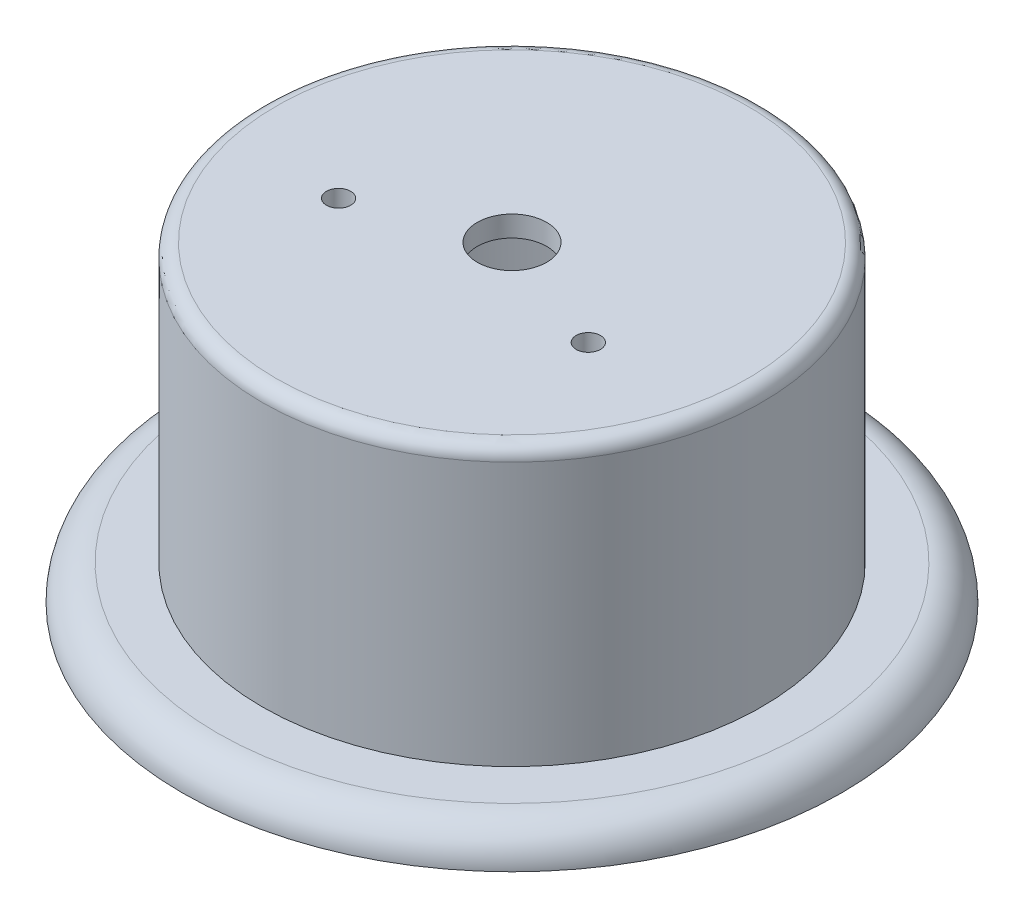
ISO-10303-21;
HEADER;
FILE_DESCRIPTION(('STEP AP214'),'2;1');
FILE_NAME('part.step','',(''),(''),'','','');
FILE_SCHEMA(('AUTOMOTIVE_DESIGN { 1 0 10303 214 1 1 1 1 }'));
ENDSEC;
DATA;
#1=APPLICATION_CONTEXT('core data for automotive mechanical design processes');
#2=APPLICATION_PROTOCOL_DEFINITION('international standard','automotive_design',2000,#1);
#3=PRODUCT_CONTEXT('',#1,'mechanical');
#4=PRODUCT('Part','Part','',(#3));
#5=PRODUCT_RELATED_PRODUCT_CATEGORY('part','',(#4));
#6=PRODUCT_DEFINITION_FORMATION('','',#4);
#7=PRODUCT_DEFINITION_CONTEXT('part definition',#1,'design');
#8=PRODUCT_DEFINITION('design','',#6,#7);
#9=PRODUCT_DEFINITION_SHAPE('','',#8);
#10=(LENGTH_UNIT() NAMED_UNIT(*) SI_UNIT(.MILLI.,.METRE.));
#11=(NAMED_UNIT(*) PLANE_ANGLE_UNIT() SI_UNIT($,.RADIAN.));
#12=(NAMED_UNIT(*) SI_UNIT($,.STERADIAN.) SOLID_ANGLE_UNIT());
#13=UNCERTAINTY_MEASURE_WITH_UNIT(LENGTH_MEASURE(1.E-05),#10,'distance_accuracy_value','');
#14=(GEOMETRIC_REPRESENTATION_CONTEXT(3) GLOBAL_UNCERTAINTY_ASSIGNED_CONTEXT((#13)) GLOBAL_UNIT_ASSIGNED_CONTEXT((#10,
#11,#12)) REPRESENTATION_CONTEXT('',''));
#15=CARTESIAN_POINT('',(0.,0.,0.));
#16=DIRECTION('',(0.,0.,1.));
#17=DIRECTION('',(1.,0.,0.));
#18=AXIS2_PLACEMENT_3D('',#15,#16,#17);
#19=CARTESIAN_POINT('',(0.,5.,0.));
#20=DIRECTION('',(0.,1.,0.));
#21=DIRECTION('',(0.,0.,1.));
#22=AXIS2_PLACEMENT_3D('',#19,#20,#21);
#23=PLANE('',#22);
#24=CARTESIAN_POINT('',(0.,5.,0.));
#25=DIRECTION('',(0.,1.,0.));
#26=DIRECTION('',(0.,0.,1.));
#27=AXIS2_PLACEMENT_3D('',#24,#25,#26);
#28=CIRCLE('',#27,42.5);
#29=CARTESIAN_POINT('',(0.,5.,42.5));
#30=VERTEX_POINT('',#29);
#31=EDGE_CURVE('E41',#30,#30,#28,.T.);
#32=ORIENTED_EDGE('',*,*,#31,.T.);
#33=EDGE_LOOP('',(#32));
#34=FACE_BOUND('',#33,.T.);
#35=CARTESIAN_POINT('',(0.,5.,0.));
#36=DIRECTION('',(0.,1.,0.));
#37=DIRECTION('',(0.,0.,1.));
#38=AXIS2_PLACEMENT_3D('',#35,#36,#37);
#39=CIRCLE('',#38,36.);
#40=CARTESIAN_POINT('',(0.,5.,36.));
#41=VERTEX_POINT('',#40);
#42=EDGE_CURVE('E63',#41,#41,#39,.T.);
#43=ORIENTED_EDGE('',*,*,#42,.F.);
#44=EDGE_LOOP('',(#43));
#45=FACE_BOUND('',#44,.T.);
#46=ADVANCED_FACE('F30',(#34,#45),#23,.T.);
#47=CARTESIAN_POINT('',(0.,0.,0.));
#48=DIRECTION('',(0.,1.,0.));
#49=DIRECTION('',(0.,0.,1.));
#50=AXIS2_PLACEMENT_3D('',#47,#48,#49);
#51=PLANE('',#50);
#52=CARTESIAN_POINT('',(0.,0.,0.));
#53=DIRECTION('',(0.,-1.,0.));
#54=DIRECTION('',(0.,0.,-1.));
#55=AXIS2_PLACEMENT_3D('',#52,#53,#54);
#56=CIRCLE('',#55,34.5);
#57=CARTESIAN_POINT('',(0.,0.,-34.5));
#58=VERTEX_POINT('',#57);
#59=EDGE_CURVE('E60',#58,#58,#56,.T.);
#60=ORIENTED_EDGE('',*,*,#59,.F.);
#61=EDGE_LOOP('',(#60));
#62=FACE_BOUND('',#61,.T.);
#63=CARTESIAN_POINT('',(0.,0.,0.));
#64=DIRECTION('',(0.,1.,0.));
#65=DIRECTION('',(0.,0.,1.));
#66=AXIS2_PLACEMENT_3D('',#63,#64,#65);
#67=CIRCLE('',#66,47.5);
#68=CARTESIAN_POINT('',(0.,0.,47.5));
#69=VERTEX_POINT('',#68);
#70=EDGE_CURVE('E45',#69,#69,#67,.T.);
#71=ORIENTED_EDGE('',*,*,#70,.F.);
#72=EDGE_LOOP('',(#71));
#73=FACE_BOUND('',#72,.T.);
#74=ADVANCED_FACE('F106',(#62,#73),#51,.F.);
#75=CARTESIAN_POINT('',(0.,45.,0.));
#76=DIRECTION('',(0.,-1.,0.));
#77=DIRECTION('',(0.,0.,-1.));
#78=AXIS2_PLACEMENT_3D('',#75,#76,#77);
#79=CYLINDRICAL_SURFACE('',#78,36.);
#80=CARTESIAN_POINT('',(0.,43.,0.));
#81=DIRECTION('',(0.,1.,0.));
#82=DIRECTION('',(0.,0.,1.));
#83=AXIS2_PLACEMENT_3D('',#80,#81,#82);
#84=CIRCLE('',#83,36.);
#85=CARTESIAN_POINT('',(0.,43.,36.));
#86=VERTEX_POINT('',#85);
#87=EDGE_CURVE('E10',#86,#86,#84,.F.);
#88=ORIENTED_EDGE('',*,*,#87,.T.);
#89=EDGE_LOOP('',(#88));
#90=FACE_BOUND('',#89,.T.);
#91=ORIENTED_EDGE('',*,*,#42,.T.);
#92=EDGE_LOOP('',(#91));
#93=FACE_BOUND('',#92,.T.);
#94=ADVANCED_FACE('F84',(#90,#93),#79,.T.);
#95=CARTESIAN_POINT('',(0.,45.,0.));
#96=DIRECTION('',(0.,1.,0.));
#97=DIRECTION('',(0.,0.,1.));
#98=AXIS2_PLACEMENT_3D('',#95,#96,#97);
#99=PLANE('',#98);
#100=CARTESIAN_POINT('',(0.,45.,0.));
#101=DIRECTION('',(0.,1.,0.));
#102=DIRECTION('',(0.,0.,1.));
#103=AXIS2_PLACEMENT_3D('',#100,#101,#102);
#104=CIRCLE('',#103,34.);
#105=CARTESIAN_POINT('',(0.,45.,34.));
#106=VERTEX_POINT('',#105);
#107=EDGE_CURVE('E37',#106,#106,#104,.T.);
#108=ORIENTED_EDGE('',*,*,#107,.T.);
#109=EDGE_LOOP('',(#108));
#110=FACE_BOUND('',#109,.T.);
#111=CARTESIAN_POINT('',(-18.,45.,7.));
#112=DIRECTION('',(0.,1.,0.));
#113=DIRECTION('',(0.,0.,1.));
#114=AXIS2_PLACEMENT_3D('',#111,#112,#113);
#115=CIRCLE('',#114,1.75);
#116=CARTESIAN_POINT('',(-18.,45.,8.75));
#117=VERTEX_POINT('',#116);
#118=EDGE_CURVE('E52',#117,#117,#115,.T.);
#119=ORIENTED_EDGE('',*,*,#118,.F.);
#120=EDGE_LOOP('',(#119));
#121=FACE_BOUND('',#120,.T.);
#122=CARTESIAN_POINT('',(18.,45.,7.));
#123=DIRECTION('',(0.,1.,0.));
#124=DIRECTION('',(0.,0.,1.));
#125=AXIS2_PLACEMENT_3D('',#122,#123,#124);
#126=CIRCLE('',#125,1.75);
#127=CARTESIAN_POINT('',(18.,45.,8.75));
#128=VERTEX_POINT('',#127);
#129=EDGE_CURVE('E51',#128,#128,#126,.T.);
#130=ORIENTED_EDGE('',*,*,#129,.F.);
#131=EDGE_LOOP('',(#130));
#132=FACE_BOUND('',#131,.T.);
#133=CARTESIAN_POINT('',(0.,45.,0.));
#134=DIRECTION('',(0.,1.,0.));
#135=DIRECTION('',(0.,0.,1.));
#136=AXIS2_PLACEMENT_3D('',#133,#134,#135);
#137=CIRCLE('',#136,5.);
#138=CARTESIAN_POINT('',(0.,45.,5.));
#139=VERTEX_POINT('',#138);
#140=EDGE_CURVE('E55',#139,#139,#137,.T.);
#141=ORIENTED_EDGE('',*,*,#140,.F.);
#142=EDGE_LOOP('',(#141));
#143=FACE_BOUND('',#142,.T.);
#144=ADVANCED_FACE('F80',(#110,#121,#132,#143),#99,.T.);
#145=CARTESIAN_POINT('',(0.,42.,0.));
#146=DIRECTION('',(0.,-1.,0.));
#147=DIRECTION('',(0.,0.,-1.));
#148=AXIS2_PLACEMENT_3D('',#145,#146,#147);
#149=CYLINDRICAL_SURFACE('',#148,34.5);
#150=CARTESIAN_POINT('',(0.,42.,0.));
#151=DIRECTION('',(0.,-1.,0.));
#152=DIRECTION('',(0.,0.,-1.));
#153=AXIS2_PLACEMENT_3D('',#150,#151,#152);
#154=CIRCLE('',#153,34.5);
#155=CARTESIAN_POINT('',(0.,42.,-34.5));
#156=VERTEX_POINT('',#155);
#157=EDGE_CURVE('E66',#156,#156,#154,.T.);
#158=CARTESIAN_POINT('',(0.,42.,-34.5));
#159=CARTESIAN_POINT('',(0.,41.5625,-34.5));
#160=CARTESIAN_POINT('',(0.,41.125,-34.5));
#161=CARTESIAN_POINT('',(0.,40.25,-34.5));
#162=CARTESIAN_POINT('',(0.,39.8125,-34.5));
#163=CARTESIAN_POINT('',(0.,38.9375,-34.5));
#164=CARTESIAN_POINT('',(0.,38.5,-34.5));
#165=CARTESIAN_POINT('',(0.,37.625,-34.5));
#166=CARTESIAN_POINT('',(0.,37.1875,-34.5));
#167=CARTESIAN_POINT('',(0.,36.3125,-34.5));
#168=CARTESIAN_POINT('',(0.,35.875,-34.5));
#169=CARTESIAN_POINT('',(0.,35.,-34.5));
#170=CARTESIAN_POINT('',(0.,34.5625,-34.5));
#171=CARTESIAN_POINT('',(0.,33.6875,-34.5));
#172=CARTESIAN_POINT('',(0.,33.25,-34.5));
#173=CARTESIAN_POINT('',(0.,32.375,-34.5));
#174=CARTESIAN_POINT('',(0.,31.9375,-34.5));
#175=CARTESIAN_POINT('',(0.,31.0625,-34.5));
#176=CARTESIAN_POINT('',(0.,30.625,-34.5));
#177=CARTESIAN_POINT('',(0.,29.75,-34.5));
#178=CARTESIAN_POINT('',(0.,29.3125,-34.5));
#179=CARTESIAN_POINT('',(0.,28.4375,-34.5));
#180=CARTESIAN_POINT('',(0.,28.,-34.5));
#181=CARTESIAN_POINT('',(0.,27.125,-34.5));
#182=CARTESIAN_POINT('',(0.,26.6875,-34.5));
#183=CARTESIAN_POINT('',(0.,25.8125,-34.5));
#184=CARTESIAN_POINT('',(0.,25.375,-34.5));
#185=CARTESIAN_POINT('',(0.,24.5,-34.5));
#186=CARTESIAN_POINT('',(0.,24.0625,-34.5));
#187=CARTESIAN_POINT('',(0.,23.1875,-34.5));
#188=CARTESIAN_POINT('',(0.,22.75,-34.5));
#189=CARTESIAN_POINT('',(0.,21.875,-34.5));
#190=CARTESIAN_POINT('',(0.,21.4375,-34.5));
#191=CARTESIAN_POINT('',(0.,20.5625,-34.5));
#192=CARTESIAN_POINT('',(0.,20.125,-34.5));
#193=CARTESIAN_POINT('',(0.,19.25,-34.5));
#194=CARTESIAN_POINT('',(0.,18.8125,-34.5));
#195=CARTESIAN_POINT('',(0.,17.9375,-34.5));
#196=CARTESIAN_POINT('',(0.,17.5,-34.5));
#197=CARTESIAN_POINT('',(0.,16.625,-34.5));
#198=CARTESIAN_POINT('',(0.,16.1875,-34.5));
#199=CARTESIAN_POINT('',(0.,15.3125,-34.5));
#200=CARTESIAN_POINT('',(0.,14.875,-34.5));
#201=CARTESIAN_POINT('',(0.,14.,-34.5));
#202=CARTESIAN_POINT('',(0.,13.5625,-34.5));
#203=CARTESIAN_POINT('',(0.,12.6875,-34.5));
#204=CARTESIAN_POINT('',(0.,12.25,-34.5));
#205=CARTESIAN_POINT('',(0.,11.375,-34.5));
#206=CARTESIAN_POINT('',(0.,10.9375,-34.5));
#207=CARTESIAN_POINT('',(0.,10.0625,-34.5));
#208=CARTESIAN_POINT('',(0.,9.625,-34.5));
#209=CARTESIAN_POINT('',(0.,8.75,-34.5));
#210=CARTESIAN_POINT('',(0.,8.3125,-34.5));
#211=CARTESIAN_POINT('',(0.,7.4375,-34.5));
#212=CARTESIAN_POINT('',(0.,7.,-34.5));
#213=CARTESIAN_POINT('',(0.,6.12500000000001,-34.5));
#214=CARTESIAN_POINT('',(0.,5.68750000000001,-34.5));
#215=CARTESIAN_POINT('',(0.,4.8125,-34.5));
#216=CARTESIAN_POINT('',(0.,4.375,-34.5));
#217=CARTESIAN_POINT('',(0.,3.5,-34.5));
#218=CARTESIAN_POINT('',(0.,3.0625,-34.5));
#219=CARTESIAN_POINT('',(0.,2.1875,-34.5));
#220=CARTESIAN_POINT('',(0.,1.75,-34.5));
#221=CARTESIAN_POINT('',(0.,0.875000000000001,-34.5));
#222=CARTESIAN_POINT('',(0.,0.4375,-34.5));
#223=CARTESIAN_POINT('',(0.,0.,-34.5));
#224=B_SPLINE_CURVE_WITH_KNOTS('',3,(#158,#159,#160,#161,#162,#163,#164,#165,#166,#167,#168,
#169,#170,#171,#172,#173,#174,#175,#176,#177,#178,#179,#180,#181,#182,#183,#184,#185,#186,#187,
#188,#189,#190,#191,#192,#193,#194,#195,#196,#197,#198,#199,#200,#201,#202,#203,#204,#205,#206,
#207,#208,#209,#210,#211,#212,#213,#214,#215,#216,#217,#218,#219,#220,#221,#222,#223),
.UNSPECIFIED.,.F.,.F.,(4,2,2,2,2,2,2,2,2,2,2,2,2,2,2,2,2,2,2,2,2,2,2,2,2,2,2,2,2,2,2,2,4),(0.,
1.3125,2.625,3.9375,5.25,6.56250000000001,7.87500000000001,9.1875,10.5,11.8125,13.125,14.4375,
15.75,17.0625,18.375,19.6875,21.,22.3125,23.625,24.9375,26.25,27.5625,28.875,30.1875,31.5,
32.8125,34.125,35.4375,36.75,38.0625,39.375,40.6875,42.),.UNSPECIFIED.);
#225=EDGE_CURVE('BSEAM83',#156,#58,#224,.T.);
#226=ORIENTED_EDGE('',*,*,#157,.F.);
#227=ORIENTED_EDGE('',*,*,#59,.T.);
#228=ORIENTED_EDGE('',*,*,#225,.T.);
#229=ORIENTED_EDGE('',*,*,#225,.F.);
#230=EDGE_LOOP('',(#226,#228,#227,#229));
#231=FACE_BOUND('',#230,.T.);
#232=ADVANCED_FACE('F83',(#231),#149,.F.);
#233=CARTESIAN_POINT('',(0.,42.,0.));
#234=DIRECTION('',(0.,-1.,0.));
#235=DIRECTION('',(0.,0.,-1.));
#236=AXIS2_PLACEMENT_3D('',#233,#234,#235);
#237=PLANE('',#236);
#238=CARTESIAN_POINT('',(-18.,42.,7.));
#239=DIRECTION('',(0.,-1.,0.));
#240=DIRECTION('',(0.,0.,-1.));
#241=AXIS2_PLACEMENT_3D('',#238,#239,#240);
#242=CIRCLE('',#241,1.75);
#243=CARTESIAN_POINT('',(-18.,42.,5.25));
#244=VERTEX_POINT('',#243);
#245=EDGE_CURVE('E48',#244,#244,#242,.T.);
#246=ORIENTED_EDGE('',*,*,#245,.F.);
#247=EDGE_LOOP('',(#246));
#248=FACE_BOUND('',#247,.T.);
#249=CARTESIAN_POINT('',(18.,42.,7.));
#250=DIRECTION('',(0.,-1.,0.));
#251=DIRECTION('',(0.,0.,-1.));
#252=AXIS2_PLACEMENT_3D('',#249,#250,#251);
#253=CIRCLE('',#252,1.75);
#254=CARTESIAN_POINT('',(18.,42.,5.25));
#255=VERTEX_POINT('',#254);
#256=EDGE_CURVE('E53',#255,#255,#253,.T.);
#257=ORIENTED_EDGE('',*,*,#256,.F.);
#258=EDGE_LOOP('',(#257));
#259=FACE_BOUND('',#258,.T.);
#260=CARTESIAN_POINT('',(0.,42.,0.));
#261=DIRECTION('',(0.,-1.,0.));
#262=DIRECTION('',(0.,0.,-1.));
#263=AXIS2_PLACEMENT_3D('',#260,#261,#262);
#264=CIRCLE('',#263,5.);
#265=CARTESIAN_POINT('',(0.,42.,-5.));
#266=VERTEX_POINT('',#265);
#267=EDGE_CURVE('E57',#266,#266,#264,.T.);
#268=ORIENTED_EDGE('',*,*,#267,.F.);
#269=EDGE_LOOP('',(#268));
#270=FACE_BOUND('',#269,.T.);
#271=ORIENTED_EDGE('',*,*,#157,.T.);
#272=EDGE_LOOP('',(#271));
#273=FACE_BOUND('',#272,.T.);
#274=ADVANCED_FACE('F93',(#248,#259,#270,#273),#237,.T.);
#275=CARTESIAN_POINT('',(0.,40.,0.));
#276=DIRECTION('',(0.,1.,0.));
#277=DIRECTION('',(0.,0.,1.));
#278=AXIS2_PLACEMENT_3D('',#275,#276,#277);
#279=CYLINDRICAL_SURFACE('',#278,5.);
#280=ORIENTED_EDGE('',*,*,#267,.T.);
#281=EDGE_LOOP('',(#280));
#282=FACE_BOUND('',#281,.T.);
#283=ORIENTED_EDGE('',*,*,#140,.T.);
#284=EDGE_LOOP('',(#283));
#285=FACE_BOUND('',#284,.T.);
#286=ADVANCED_FACE('F90',(#282,#285),#279,.F.);
#287=CARTESIAN_POINT('',(0.,0.,0.));
#288=DIRECTION('',(0.,1.,0.));
#289=DIRECTION('',(0.,0.,1.));
#290=AXIS2_PLACEMENT_3D('',#287,#288,#289);
#291=TOROIDAL_SURFACE('',#290,42.5,5.);
#292=ORIENTED_EDGE('',*,*,#70,.T.);
#293=EDGE_LOOP('',(#292));
#294=FACE_BOUND('',#293,.T.);
#295=ORIENTED_EDGE('',*,*,#31,.F.);
#296=EDGE_LOOP('',(#295));
#297=FACE_BOUND('',#296,.T.);
#298=ADVANCED_FACE('F92',(#294,#297),#291,.T.);
#299=CARTESIAN_POINT('',(18.,40.,7.));
#300=DIRECTION('',(0.,1.,0.));
#301=DIRECTION('',(0.,0.,1.));
#302=AXIS2_PLACEMENT_3D('',#299,#300,#301);
#303=CYLINDRICAL_SURFACE('',#302,1.75);
#304=ORIENTED_EDGE('',*,*,#256,.T.);
#305=EDGE_LOOP('',(#304));
#306=FACE_BOUND('',#305,.T.);
#307=ORIENTED_EDGE('',*,*,#129,.T.);
#308=EDGE_LOOP('',(#307));
#309=FACE_BOUND('',#308,.T.);
#310=ADVANCED_FACE('F100',(#306,#309),#303,.F.);
#311=CARTESIAN_POINT('',(-18.,40.,7.));
#312=DIRECTION('',(0.,1.,0.));
#313=DIRECTION('',(0.,0.,1.));
#314=AXIS2_PLACEMENT_3D('',#311,#312,#313);
#315=CYLINDRICAL_SURFACE('',#314,1.75);
#316=ORIENTED_EDGE('',*,*,#245,.T.);
#317=EDGE_LOOP('',(#316));
#318=FACE_BOUND('',#317,.T.);
#319=ORIENTED_EDGE('',*,*,#118,.T.);
#320=EDGE_LOOP('',(#319));
#321=FACE_BOUND('',#320,.T.);
#322=ADVANCED_FACE('F78',(#318,#321),#315,.F.);
#323=CARTESIAN_POINT('',(0.,43.,0.));
#324=DIRECTION('',(0.,1.,0.));
#325=DIRECTION('',(0.,0.,1.));
#326=AXIS2_PLACEMENT_3D('',#323,#324,#325);
#327=TOROIDAL_SURFACE('',#326,34.,2.);
#328=ORIENTED_EDGE('',*,*,#87,.F.);
#329=EDGE_LOOP('',(#328));
#330=FACE_BOUND('',#329,.T.);
#331=ORIENTED_EDGE('',*,*,#107,.F.);
#332=EDGE_LOOP('',(#331));
#333=FACE_BOUND('',#332,.T.);
#334=ADVANCED_FACE('F32',(#330,#333),#327,.T.);
#335=CLOSED_SHELL('',(#46,#74,#94,#144,#232,#274,#286,#298,#310,#322,#334));
#336=MANIFOLD_SOLID_BREP('B2',#335);
#337=ADVANCED_BREP_SHAPE_REPRESENTATION('',(#18,#336),#14);
#338=SHAPE_DEFINITION_REPRESENTATION(#9,#337);
ENDSEC;
END-ISO-10303-21;
